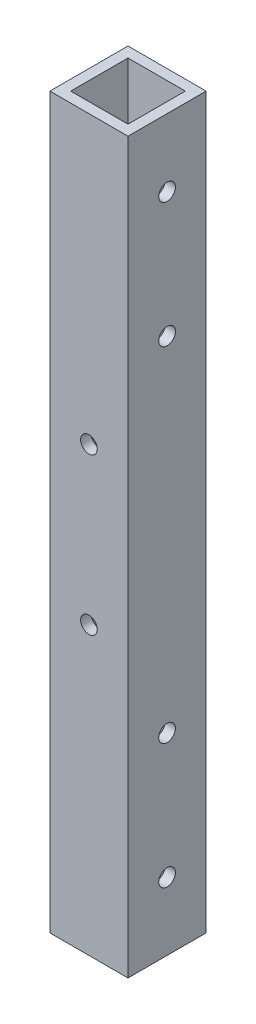
ISO-10303-21;
HEADER;
FILE_DESCRIPTION(('STEP AP214'),'2;1');
FILE_NAME('part.step','',(''),(''),'','','');
FILE_SCHEMA(('AUTOMOTIVE_DESIGN { 1 0 10303 214 1 1 1 1 }'));
ENDSEC;
DATA;
#1=APPLICATION_CONTEXT('core data for automotive mechanical design processes');
#2=APPLICATION_PROTOCOL_DEFINITION('international standard','automotive_design',2000,#1);
#3=PRODUCT_CONTEXT('',#1,'mechanical');
#4=PRODUCT('Part','Part','',(#3));
#5=PRODUCT_RELATED_PRODUCT_CATEGORY('part','',(#4));
#6=PRODUCT_DEFINITION_FORMATION('','',#4);
#7=PRODUCT_DEFINITION_CONTEXT('part definition',#1,'design');
#8=PRODUCT_DEFINITION('design','',#6,#7);
#9=PRODUCT_DEFINITION_SHAPE('','',#8);
#10=(LENGTH_UNIT() NAMED_UNIT(*) SI_UNIT(.MILLI.,.METRE.));
#11=(NAMED_UNIT(*) PLANE_ANGLE_UNIT() SI_UNIT($,.RADIAN.));
#12=(NAMED_UNIT(*) SI_UNIT($,.STERADIAN.) SOLID_ANGLE_UNIT());
#13=UNCERTAINTY_MEASURE_WITH_UNIT(LENGTH_MEASURE(1.E-05),#10,'distance_accuracy_value','');
#14=(GEOMETRIC_REPRESENTATION_CONTEXT(3) GLOBAL_UNCERTAINTY_ASSIGNED_CONTEXT((#13)) GLOBAL_UNIT_ASSIGNED_CONTEXT((#10,
#11,#12)) REPRESENTATION_CONTEXT('',''));
#15=CARTESIAN_POINT('',(0.,0.,0.));
#16=DIRECTION('',(0.,0.,1.));
#17=DIRECTION('',(1.,0.,0.));
#18=AXIS2_PLACEMENT_3D('',#15,#16,#17);
#19=CARTESIAN_POINT('',(0.,140.,0.));
#20=DIRECTION('',(0.,-1.,0.));
#21=DIRECTION('',(0.,0.,-1.));
#22=AXIS2_PLACEMENT_3D('',#19,#20,#21);
#23=PLANE('',#22);
#24=DIRECTION('',(0.,0.,1.));
#25=VECTOR('',#24,1.);
#26=CARTESIAN_POINT('',(0.,140.,0.));
#27=LINE('',#26,#25);
#28=CARTESIAN_POINT('',(0.,140.,-15.));
#29=VERTEX_POINT('',#28);
#30=CARTESIAN_POINT('',(0.,140.,0.));
#31=VERTEX_POINT('',#30);
#32=EDGE_CURVE('E162',#29,#31,#27,.T.);
#33=ORIENTED_EDGE('',*,*,#32,.T.);
#34=DIRECTION('',(1.,0.,0.));
#35=VECTOR('',#34,1.);
#36=CARTESIAN_POINT('',(0.,140.,0.));
#37=LINE('',#36,#35);
#38=CARTESIAN_POINT('',(15.,140.,0.));
#39=VERTEX_POINT('',#38);
#40=EDGE_CURVE('E166',#31,#39,#37,.T.);
#41=ORIENTED_EDGE('',*,*,#40,.T.);
#42=DIRECTION('',(0.,0.,-1.));
#43=VECTOR('',#42,1.);
#44=CARTESIAN_POINT('',(15.,140.,0.));
#45=LINE('',#44,#43);
#46=CARTESIAN_POINT('',(15.,140.,-15.));
#47=VERTEX_POINT('',#46);
#48=EDGE_CURVE('E170',#39,#47,#45,.T.);
#49=ORIENTED_EDGE('',*,*,#48,.T.);
#50=DIRECTION('',(-1.,0.,0.));
#51=VECTOR('',#50,1.);
#52=CARTESIAN_POINT('',(0.,140.,-15.));
#53=LINE('',#52,#51);
#54=EDGE_CURVE('E173',#47,#29,#53,.T.);
#55=ORIENTED_EDGE('',*,*,#54,.T.);
#56=EDGE_LOOP('',(#33,#41,#49,#55));
#57=FACE_BOUND('',#56,.T.);
#58=DIRECTION('',(1.,0.,0.));
#59=VECTOR('',#58,1.);
#60=CARTESIAN_POINT('',(2.,140.,-2.));
#61=LINE('',#60,#59);
#62=CARTESIAN_POINT('',(2.,140.,-2.));
#63=VERTEX_POINT('',#62);
#64=CARTESIAN_POINT('',(13.,140.,-2.));
#65=VERTEX_POINT('',#64);
#66=EDGE_CURVE('E112',#63,#65,#61,.T.);
#67=ORIENTED_EDGE('',*,*,#66,.F.);
#68=DIRECTION('',(0.,0.,1.));
#69=VECTOR('',#68,1.);
#70=CARTESIAN_POINT('',(2.,140.,-2.));
#71=LINE('',#70,#69);
#72=CARTESIAN_POINT('',(2.,140.,-13.));
#73=VERTEX_POINT('',#72);
#74=EDGE_CURVE('E138',#73,#63,#71,.T.);
#75=ORIENTED_EDGE('',*,*,#74,.F.);
#76=DIRECTION('',(-1.,0.,0.));
#77=VECTOR('',#76,1.);
#78=CARTESIAN_POINT('',(2.,140.,-13.));
#79=LINE('',#78,#77);
#80=CARTESIAN_POINT('',(13.,140.,-13.));
#81=VERTEX_POINT('',#80);
#82=EDGE_CURVE('E134',#81,#73,#79,.T.);
#83=ORIENTED_EDGE('',*,*,#82,.F.);
#84=DIRECTION('',(0.,0.,-1.));
#85=VECTOR('',#84,1.);
#86=CARTESIAN_POINT('',(13.,140.,-2.));
#87=LINE('',#86,#85);
#88=EDGE_CURVE('E121',#65,#81,#87,.T.);
#89=ORIENTED_EDGE('',*,*,#88,.F.);
#90=EDGE_LOOP('',(#67,#75,#83,#89));
#91=FACE_BOUND('',#90,.T.);
#92=ADVANCED_FACE('F44',(#57,#91),#23,.F.);
#93=CARTESIAN_POINT('',(0.,0.,0.));
#94=DIRECTION('',(0.,-1.,0.));
#95=DIRECTION('',(0.,0.,-1.));
#96=AXIS2_PLACEMENT_3D('',#93,#94,#95);
#97=PLANE('',#96);
#98=DIRECTION('',(0.,0.,1.));
#99=VECTOR('',#98,1.);
#100=CARTESIAN_POINT('',(0.,0.,0.));
#101=LINE('',#100,#99);
#102=CARTESIAN_POINT('',(0.,0.,-15.));
#103=VERTEX_POINT('',#102);
#104=CARTESIAN_POINT('',(0.,0.,0.));
#105=VERTEX_POINT('',#104);
#106=EDGE_CURVE('E130',#103,#105,#101,.T.);
#107=ORIENTED_EDGE('',*,*,#106,.F.);
#108=DIRECTION('',(-1.,0.,0.));
#109=VECTOR('',#108,1.);
#110=CARTESIAN_POINT('',(0.,0.,-15.));
#111=LINE('',#110,#109);
#112=CARTESIAN_POINT('',(15.,0.,-15.));
#113=VERTEX_POINT('',#112);
#114=EDGE_CURVE('E167',#113,#103,#111,.T.);
#115=ORIENTED_EDGE('',*,*,#114,.F.);
#116=DIRECTION('',(0.,0.,-1.));
#117=VECTOR('',#116,1.);
#118=CARTESIAN_POINT('',(15.,0.,0.));
#119=LINE('',#118,#117);
#120=CARTESIAN_POINT('',(15.,0.,0.));
#121=VERTEX_POINT('',#120);
#122=EDGE_CURVE('E183',#121,#113,#119,.T.);
#123=ORIENTED_EDGE('',*,*,#122,.F.);
#124=DIRECTION('',(1.,0.,0.));
#125=VECTOR('',#124,1.);
#126=CARTESIAN_POINT('',(0.,0.,0.));
#127=LINE('',#126,#125);
#128=EDGE_CURVE('E180',#105,#121,#127,.T.);
#129=ORIENTED_EDGE('',*,*,#128,.F.);
#130=EDGE_LOOP('',(#107,#115,#123,#129));
#131=FACE_BOUND('',#130,.T.);
#132=DIRECTION('',(0.,0.,1.));
#133=VECTOR('',#132,1.);
#134=CARTESIAN_POINT('',(2.,0.,-2.));
#135=LINE('',#134,#133);
#136=CARTESIAN_POINT('',(2.,0.,-13.));
#137=VERTEX_POINT('',#136);
#138=CARTESIAN_POINT('',(2.,0.,-2.));
#139=VERTEX_POINT('',#138);
#140=EDGE_CURVE('E122',#137,#139,#135,.T.);
#141=ORIENTED_EDGE('',*,*,#140,.T.);
#142=DIRECTION('',(1.,0.,0.));
#143=VECTOR('',#142,1.);
#144=CARTESIAN_POINT('',(2.,0.,-2.));
#145=LINE('',#144,#143);
#146=CARTESIAN_POINT('',(13.,0.,-2.));
#147=VERTEX_POINT('',#146);
#148=EDGE_CURVE('E70',#139,#147,#145,.T.);
#149=ORIENTED_EDGE('',*,*,#148,.T.);
#150=DIRECTION('',(0.,0.,-1.));
#151=VECTOR('',#150,1.);
#152=CARTESIAN_POINT('',(13.,0.,-2.));
#153=LINE('',#152,#151);
#154=CARTESIAN_POINT('',(13.,0.,-13.));
#155=VERTEX_POINT('',#154);
#156=EDGE_CURVE('E128',#147,#155,#153,.T.);
#157=ORIENTED_EDGE('',*,*,#156,.T.);
#158=DIRECTION('',(-1.,0.,0.));
#159=VECTOR('',#158,1.);
#160=CARTESIAN_POINT('',(2.,0.,-13.));
#161=LINE('',#160,#159);
#162=EDGE_CURVE('E149',#155,#137,#161,.T.);
#163=ORIENTED_EDGE('',*,*,#162,.T.);
#164=EDGE_LOOP('',(#141,#149,#157,#163));
#165=FACE_BOUND('',#164,.T.);
#166=ADVANCED_FACE('F331',(#131,#165),#97,.T.);
#167=CARTESIAN_POINT('',(0.,140.,0.));
#168=DIRECTION('',(1.,0.,0.));
#169=DIRECTION('',(0.,0.,-1.));
#170=AXIS2_PLACEMENT_3D('',#167,#168,#169);
#171=PLANE('',#170);
#172=CARTESIAN_POINT('',(0.,12.9999999999999,-7.50000000000069));
#173=DIRECTION('',(1.,0.,0.));
#174=DIRECTION('',(0.,0.,-1.));
#175=AXIS2_PLACEMENT_3D('',#172,#173,#174);
#176=CIRCLE('',#175,1.6);
#177=CARTESIAN_POINT('',(0.,12.9999999999999,-9.10000000000069));
#178=VERTEX_POINT('',#177);
#179=EDGE_CURVE('E203',#178,#178,#176,.T.);
#180=ORIENTED_EDGE('',*,*,#179,.T.);
#181=EDGE_LOOP('',(#180));
#182=FACE_BOUND('',#181,.T.);
#183=CARTESIAN_POINT('',(0.,37.,-7.50000000000069));
#184=DIRECTION('',(1.,0.,0.));
#185=DIRECTION('',(0.,0.,-1.));
#186=AXIS2_PLACEMENT_3D('',#183,#184,#185);
#187=CIRCLE('',#186,1.6);
#188=CARTESIAN_POINT('',(0.,37.,-9.10000000000069));
#189=VERTEX_POINT('',#188);
#190=EDGE_CURVE('E261',#189,#189,#187,.T.);
#191=ORIENTED_EDGE('',*,*,#190,.T.);
#192=EDGE_LOOP('',(#191));
#193=FACE_BOUND('',#192,.T.);
#194=CARTESIAN_POINT('',(0.,103.,-7.50000000000069));
#195=DIRECTION('',(1.,0.,0.));
#196=DIRECTION('',(0.,0.,1.));
#197=AXIS2_PLACEMENT_3D('',#194,#195,#196);
#198=CIRCLE('',#197,1.6);
#199=CARTESIAN_POINT('',(0.,103.,-5.90000000000069));
#200=VERTEX_POINT('',#199);
#201=EDGE_CURVE('E269',#200,#200,#198,.T.);
#202=ORIENTED_EDGE('',*,*,#201,.T.);
#203=EDGE_LOOP('',(#202));
#204=FACE_BOUND('',#203,.T.);
#205=CARTESIAN_POINT('',(0.,127.,-7.50000000000069));
#206=DIRECTION('',(1.,0.,0.));
#207=DIRECTION('',(0.,0.,1.));
#208=AXIS2_PLACEMENT_3D('',#205,#206,#207);
#209=CIRCLE('',#208,1.60000000000001);
#210=CARTESIAN_POINT('',(0.,127.,-5.90000000000068));
#211=VERTEX_POINT('',#210);
#212=EDGE_CURVE('E249',#211,#211,#209,.T.);
#213=ORIENTED_EDGE('',*,*,#212,.T.);
#214=EDGE_LOOP('',(#213));
#215=FACE_BOUND('',#214,.T.);
#216=ORIENTED_EDGE('',*,*,#106,.T.);
#217=DIRECTION('',(0.,-1.,0.));
#218=VECTOR('',#217,1.);
#219=CARTESIAN_POINT('',(0.,140.,0.));
#220=LINE('',#219,#218);
#221=EDGE_CURVE('E11',#31,#105,#220,.T.);
#222=ORIENTED_EDGE('',*,*,#221,.F.);
#223=ORIENTED_EDGE('',*,*,#32,.F.);
#224=DIRECTION('',(0.,-1.,0.));
#225=VECTOR('',#224,1.);
#226=CARTESIAN_POINT('',(0.,140.,-15.));
#227=LINE('',#226,#225);
#228=EDGE_CURVE('E176',#29,#103,#227,.T.);
#229=ORIENTED_EDGE('',*,*,#228,.T.);
#230=EDGE_LOOP('',(#216,#222,#223,#229));
#231=FACE_BOUND('',#230,.T.);
#232=ADVANCED_FACE('F46',(#182,#193,#204,#215,#231),#171,.F.);
#233=CARTESIAN_POINT('',(0.,140.,0.));
#234=DIRECTION('',(0.,0.,-1.));
#235=DIRECTION('',(-1.,0.,0.));
#236=AXIS2_PLACEMENT_3D('',#233,#234,#235);
#237=PLANE('',#236);
#238=CARTESIAN_POINT('',(7.50000000000001,85.,0.));
#239=DIRECTION('',(0.,0.,1.));
#240=DIRECTION('',(1.,0.,0.));
#241=AXIS2_PLACEMENT_3D('',#238,#239,#240);
#242=CIRCLE('',#241,1.6);
#243=CARTESIAN_POINT('',(9.10000000000001,85.,0.));
#244=VERTEX_POINT('',#243);
#245=EDGE_CURVE('E229',#244,#244,#242,.T.);
#246=ORIENTED_EDGE('',*,*,#245,.F.);
#247=EDGE_LOOP('',(#246));
#248=FACE_BOUND('',#247,.T.);
#249=CARTESIAN_POINT('',(7.50000000000001,55.,0.));
#250=DIRECTION('',(0.,0.,1.));
#251=DIRECTION('',(1.,0.,0.));
#252=AXIS2_PLACEMENT_3D('',#249,#250,#251);
#253=CIRCLE('',#252,1.6);
#254=CARTESIAN_POINT('',(9.10000000000001,55.,0.));
#255=VERTEX_POINT('',#254);
#256=EDGE_CURVE('E235',#255,#255,#253,.T.);
#257=ORIENTED_EDGE('',*,*,#256,.F.);
#258=EDGE_LOOP('',(#257));
#259=FACE_BOUND('',#258,.T.);
#260=ORIENTED_EDGE('',*,*,#128,.T.);
#261=DIRECTION('',(0.,-1.,0.));
#262=VECTOR('',#261,1.);
#263=CARTESIAN_POINT('',(15.,140.,0.));
#264=LINE('',#263,#262);
#265=EDGE_CURVE('E54',#39,#121,#264,.T.);
#266=ORIENTED_EDGE('',*,*,#265,.F.);
#267=ORIENTED_EDGE('',*,*,#40,.F.);
#268=ORIENTED_EDGE('',*,*,#221,.T.);
#269=EDGE_LOOP('',(#260,#266,#267,#268));
#270=FACE_BOUND('',#269,.T.);
#271=ADVANCED_FACE('F318',(#248,#259,#270),#237,.F.);
#272=CARTESIAN_POINT('',(15.,140.,0.));
#273=DIRECTION('',(-1.,0.,0.));
#274=DIRECTION('',(0.,0.,1.));
#275=AXIS2_PLACEMENT_3D('',#272,#273,#274);
#276=PLANE('',#275);
#277=CARTESIAN_POINT('',(15.,12.9999999999999,-7.50000000000069));
#278=DIRECTION('',(1.,0.,0.));
#279=DIRECTION('',(0.,0.,-1.));
#280=AXIS2_PLACEMENT_3D('',#277,#278,#279);
#281=CIRCLE('',#280,1.6);
#282=CARTESIAN_POINT('',(15.,12.9999999999999,-9.10000000000069));
#283=VERTEX_POINT('',#282);
#284=EDGE_CURVE('E253',#283,#283,#281,.T.);
#285=ORIENTED_EDGE('',*,*,#284,.F.);
#286=EDGE_LOOP('',(#285));
#287=FACE_BOUND('',#286,.T.);
#288=CARTESIAN_POINT('',(15.,37.,-7.50000000000069));
#289=DIRECTION('',(1.,0.,0.));
#290=DIRECTION('',(0.,0.,-1.));
#291=AXIS2_PLACEMENT_3D('',#288,#289,#290);
#292=CIRCLE('',#291,1.6);
#293=CARTESIAN_POINT('',(15.,37.,-9.10000000000069));
#294=VERTEX_POINT('',#293);
#295=EDGE_CURVE('E257',#294,#294,#292,.T.);
#296=ORIENTED_EDGE('',*,*,#295,.F.);
#297=EDGE_LOOP('',(#296));
#298=FACE_BOUND('',#297,.T.);
#299=CARTESIAN_POINT('',(15.,103.,-7.50000000000069));
#300=DIRECTION('',(1.,0.,0.));
#301=DIRECTION('',(0.,0.,1.));
#302=AXIS2_PLACEMENT_3D('',#299,#300,#301);
#303=CIRCLE('',#302,1.6);
#304=CARTESIAN_POINT('',(15.,103.,-5.90000000000069));
#305=VERTEX_POINT('',#304);
#306=EDGE_CURVE('E265',#305,#305,#303,.T.);
#307=ORIENTED_EDGE('',*,*,#306,.F.);
#308=EDGE_LOOP('',(#307));
#309=FACE_BOUND('',#308,.T.);
#310=CARTESIAN_POINT('',(15.,127.,-7.50000000000069));
#311=DIRECTION('',(1.,0.,0.));
#312=DIRECTION('',(0.,0.,1.));
#313=AXIS2_PLACEMENT_3D('',#310,#311,#312);
#314=CIRCLE('',#313,1.60000000000001);
#315=CARTESIAN_POINT('',(15.,127.,-5.90000000000068));
#316=VERTEX_POINT('',#315);
#317=EDGE_CURVE('E273',#316,#316,#314,.T.);
#318=ORIENTED_EDGE('',*,*,#317,.F.);
#319=EDGE_LOOP('',(#318));
#320=FACE_BOUND('',#319,.T.);
#321=ORIENTED_EDGE('',*,*,#122,.T.);
#322=DIRECTION('',(0.,-1.,0.));
#323=VECTOR('',#322,1.);
#324=CARTESIAN_POINT('',(15.,140.,-15.));
#325=LINE('',#324,#323);
#326=EDGE_CURVE('E191',#47,#113,#325,.T.);
#327=ORIENTED_EDGE('',*,*,#326,.F.);
#328=ORIENTED_EDGE('',*,*,#48,.F.);
#329=ORIENTED_EDGE('',*,*,#265,.T.);
#330=EDGE_LOOP('',(#321,#327,#328,#329));
#331=FACE_BOUND('',#330,.T.);
#332=ADVANCED_FACE('F314',(#287,#298,#309,#320,#331),#276,.F.);
#333=CARTESIAN_POINT('',(0.,140.,-15.));
#334=DIRECTION('',(0.,0.,1.));
#335=DIRECTION('',(1.,0.,0.));
#336=AXIS2_PLACEMENT_3D('',#333,#334,#335);
#337=PLANE('',#336);
#338=CARTESIAN_POINT('',(7.50000000000001,85.,-15.));
#339=DIRECTION('',(0.,0.,1.));
#340=DIRECTION('',(1.,0.,0.));
#341=AXIS2_PLACEMENT_3D('',#338,#339,#340);
#342=CIRCLE('',#341,1.6);
#343=CARTESIAN_POINT('',(9.10000000000001,85.,-15.));
#344=VERTEX_POINT('',#343);
#345=EDGE_CURVE('E221',#344,#344,#342,.T.);
#346=ORIENTED_EDGE('',*,*,#345,.T.);
#347=EDGE_LOOP('',(#346));
#348=FACE_BOUND('',#347,.T.);
#349=CARTESIAN_POINT('',(7.50000000000001,55.,-15.));
#350=DIRECTION('',(0.,0.,1.));
#351=DIRECTION('',(1.,0.,0.));
#352=AXIS2_PLACEMENT_3D('',#349,#350,#351);
#353=CIRCLE('',#352,1.6);
#354=CARTESIAN_POINT('',(9.10000000000001,55.,-15.));
#355=VERTEX_POINT('',#354);
#356=EDGE_CURVE('E241',#355,#355,#353,.T.);
#357=ORIENTED_EDGE('',*,*,#356,.T.);
#358=EDGE_LOOP('',(#357));
#359=FACE_BOUND('',#358,.T.);
#360=ORIENTED_EDGE('',*,*,#114,.T.);
#361=ORIENTED_EDGE('',*,*,#228,.F.);
#362=ORIENTED_EDGE('',*,*,#54,.F.);
#363=ORIENTED_EDGE('',*,*,#326,.T.);
#364=EDGE_LOOP('',(#360,#361,#362,#363));
#365=FACE_BOUND('',#364,.T.);
#366=ADVANCED_FACE('F317',(#348,#359,#365),#337,.F.);
#367=CARTESIAN_POINT('',(2.,140.,-2.));
#368=DIRECTION('',(0.,0.,-1.));
#369=DIRECTION('',(-1.,0.,0.));
#370=AXIS2_PLACEMENT_3D('',#367,#368,#369);
#371=PLANE('',#370);
#372=CARTESIAN_POINT('',(7.50000000000001,85.,-2.));
#373=DIRECTION('',(0.,0.,-1.));
#374=DIRECTION('',(-1.,0.,0.));
#375=AXIS2_PLACEMENT_3D('',#372,#373,#374);
#376=CIRCLE('',#375,1.6);
#377=CARTESIAN_POINT('',(5.9,85.,-2.));
#378=VERTEX_POINT('',#377);
#379=EDGE_CURVE('E245',#378,#378,#376,.T.);
#380=ORIENTED_EDGE('',*,*,#379,.F.);
#381=EDGE_LOOP('',(#380));
#382=FACE_BOUND('',#381,.T.);
#383=CARTESIAN_POINT('',(7.50000000000001,55.,-2.));
#384=DIRECTION('',(0.,0.,-1.));
#385=DIRECTION('',(-1.,0.,0.));
#386=AXIS2_PLACEMENT_3D('',#383,#384,#385);
#387=CIRCLE('',#386,1.6);
#388=CARTESIAN_POINT('',(5.90000000000001,55.,-2.));
#389=VERTEX_POINT('',#388);
#390=EDGE_CURVE('E220',#389,#389,#387,.T.);
#391=ORIENTED_EDGE('',*,*,#390,.F.);
#392=EDGE_LOOP('',(#391));
#393=FACE_BOUND('',#392,.T.);
#394=ORIENTED_EDGE('',*,*,#148,.F.);
#395=DIRECTION('',(0.,-1.,0.));
#396=VECTOR('',#395,1.);
#397=CARTESIAN_POINT('',(2.,140.,-2.));
#398=LINE('',#397,#396);
#399=EDGE_CURVE('E116',#63,#139,#398,.T.);
#400=ORIENTED_EDGE('',*,*,#399,.F.);
#401=ORIENTED_EDGE('',*,*,#66,.T.);
#402=DIRECTION('',(0.,-1.,0.));
#403=VECTOR('',#402,1.);
#404=CARTESIAN_POINT('',(13.,140.,-2.));
#405=LINE('',#404,#403);
#406=EDGE_CURVE('E115',#65,#147,#405,.T.);
#407=ORIENTED_EDGE('',*,*,#406,.T.);
#408=EDGE_LOOP('',(#394,#400,#401,#407));
#409=FACE_BOUND('',#408,.T.);
#410=ADVANCED_FACE('F114',(#382,#393,#409),#371,.T.);
#411=CARTESIAN_POINT('',(13.,140.,-2.));
#412=DIRECTION('',(-1.,0.,0.));
#413=DIRECTION('',(0.,0.,1.));
#414=AXIS2_PLACEMENT_3D('',#411,#412,#413);
#415=PLANE('',#414);
#416=CARTESIAN_POINT('',(13.,12.9999999999999,-7.50000000000069));
#417=DIRECTION('',(-1.,0.,0.));
#418=DIRECTION('',(0.,0.,1.));
#419=AXIS2_PLACEMENT_3D('',#416,#417,#418);
#420=CIRCLE('',#419,1.6);
#421=CARTESIAN_POINT('',(13.,12.9999999999999,-5.90000000000069));
#422=VERTEX_POINT('',#421);
#423=EDGE_CURVE('E146',#422,#422,#420,.T.);
#424=ORIENTED_EDGE('',*,*,#423,.F.);
#425=EDGE_LOOP('',(#424));
#426=FACE_BOUND('',#425,.T.);
#427=CARTESIAN_POINT('',(13.,37.,-7.50000000000069));
#428=DIRECTION('',(-1.,0.,0.));
#429=DIRECTION('',(0.,0.,1.));
#430=AXIS2_PLACEMENT_3D('',#427,#428,#429);
#431=CIRCLE('',#430,1.6);
#432=CARTESIAN_POINT('',(13.,37.,-5.90000000000069));
#433=VERTEX_POINT('',#432);
#434=EDGE_CURVE('E213',#433,#433,#431,.T.);
#435=ORIENTED_EDGE('',*,*,#434,.F.);
#436=EDGE_LOOP('',(#435));
#437=FACE_BOUND('',#436,.T.);
#438=CARTESIAN_POINT('',(13.,103.,-7.50000000000069));
#439=DIRECTION('',(-1.,0.,0.));
#440=DIRECTION('',(0.,0.,1.));
#441=AXIS2_PLACEMENT_3D('',#438,#439,#440);
#442=CIRCLE('',#441,1.6);
#443=CARTESIAN_POINT('',(13.,103.,-5.90000000000069));
#444=VERTEX_POINT('',#443);
#445=EDGE_CURVE('E208',#444,#444,#442,.T.);
#446=ORIENTED_EDGE('',*,*,#445,.F.);
#447=EDGE_LOOP('',(#446));
#448=FACE_BOUND('',#447,.T.);
#449=CARTESIAN_POINT('',(13.,127.,-7.50000000000069));
#450=DIRECTION('',(-1.,0.,0.));
#451=DIRECTION('',(0.,0.,1.));
#452=AXIS2_PLACEMENT_3D('',#449,#450,#451);
#453=CIRCLE('',#452,1.60000000000001);
#454=CARTESIAN_POINT('',(13.,127.,-5.90000000000068));
#455=VERTEX_POINT('',#454);
#456=EDGE_CURVE('E202',#455,#455,#453,.T.);
#457=ORIENTED_EDGE('',*,*,#456,.F.);
#458=EDGE_LOOP('',(#457));
#459=FACE_BOUND('',#458,.T.);
#460=ORIENTED_EDGE('',*,*,#156,.F.);
#461=ORIENTED_EDGE('',*,*,#406,.F.);
#462=ORIENTED_EDGE('',*,*,#88,.T.);
#463=DIRECTION('',(0.,-1.,0.));
#464=VECTOR('',#463,1.);
#465=CARTESIAN_POINT('',(13.,140.,-13.));
#466=LINE('',#465,#464);
#467=EDGE_CURVE('E131',#81,#155,#466,.T.);
#468=ORIENTED_EDGE('',*,*,#467,.T.);
#469=EDGE_LOOP('',(#460,#461,#462,#468));
#470=FACE_BOUND('',#469,.T.);
#471=ADVANCED_FACE('F125',(#426,#437,#448,#459,#470),#415,.T.);
#472=CARTESIAN_POINT('',(2.,140.,-13.));
#473=DIRECTION('',(0.,0.,1.));
#474=DIRECTION('',(1.,0.,0.));
#475=AXIS2_PLACEMENT_3D('',#472,#473,#474);
#476=PLANE('',#475);
#477=CARTESIAN_POINT('',(7.50000000000001,85.,-13.));
#478=DIRECTION('',(0.,0.,1.));
#479=DIRECTION('',(1.,0.,0.));
#480=AXIS2_PLACEMENT_3D('',#477,#478,#479);
#481=CIRCLE('',#480,1.6);
#482=CARTESIAN_POINT('',(9.10000000000001,85.,-13.));
#483=VERTEX_POINT('',#482);
#484=EDGE_CURVE('E48',#483,#483,#481,.T.);
#485=ORIENTED_EDGE('',*,*,#484,.F.);
#486=EDGE_LOOP('',(#485));
#487=FACE_BOUND('',#486,.T.);
#488=CARTESIAN_POINT('',(7.50000000000001,55.,-13.));
#489=DIRECTION('',(0.,0.,1.));
#490=DIRECTION('',(1.,0.,0.));
#491=AXIS2_PLACEMENT_3D('',#488,#489,#490);
#492=CIRCLE('',#491,1.6);
#493=CARTESIAN_POINT('',(9.10000000000001,55.,-13.));
#494=VERTEX_POINT('',#493);
#495=EDGE_CURVE('E217',#494,#494,#492,.T.);
#496=ORIENTED_EDGE('',*,*,#495,.F.);
#497=EDGE_LOOP('',(#496));
#498=FACE_BOUND('',#497,.T.);
#499=ORIENTED_EDGE('',*,*,#162,.F.);
#500=ORIENTED_EDGE('',*,*,#467,.F.);
#501=ORIENTED_EDGE('',*,*,#82,.T.);
#502=DIRECTION('',(0.,-1.,0.));
#503=VECTOR('',#502,1.);
#504=CARTESIAN_POINT('',(2.,140.,-13.));
#505=LINE('',#504,#503);
#506=EDGE_CURVE('E62',#73,#137,#505,.T.);
#507=ORIENTED_EDGE('',*,*,#506,.T.);
#508=EDGE_LOOP('',(#499,#500,#501,#507));
#509=FACE_BOUND('',#508,.T.);
#510=ADVANCED_FACE('F297',(#487,#498,#509),#476,.T.);
#511=CARTESIAN_POINT('',(2.,140.,-2.));
#512=DIRECTION('',(1.,0.,0.));
#513=DIRECTION('',(0.,0.,-1.));
#514=AXIS2_PLACEMENT_3D('',#511,#512,#513);
#515=PLANE('',#514);
#516=CARTESIAN_POINT('',(2.,12.9999999999999,-7.50000000000069));
#517=DIRECTION('',(1.,0.,0.));
#518=DIRECTION('',(0.,0.,-1.));
#519=AXIS2_PLACEMENT_3D('',#516,#517,#518);
#520=CIRCLE('',#519,1.6);
#521=CARTESIAN_POINT('',(2.,12.9999999999999,-9.10000000000069));
#522=VERTEX_POINT('',#521);
#523=EDGE_CURVE('E214',#522,#522,#520,.T.);
#524=ORIENTED_EDGE('',*,*,#523,.F.);
#525=EDGE_LOOP('',(#524));
#526=FACE_BOUND('',#525,.T.);
#527=CARTESIAN_POINT('',(2.,37.,-7.50000000000069));
#528=DIRECTION('',(1.,0.,0.));
#529=DIRECTION('',(0.,0.,-1.));
#530=AXIS2_PLACEMENT_3D('',#527,#528,#529);
#531=CIRCLE('',#530,1.6);
#532=CARTESIAN_POINT('',(2.,37.,-9.10000000000069));
#533=VERTEX_POINT('',#532);
#534=EDGE_CURVE('E209',#533,#533,#531,.T.);
#535=ORIENTED_EDGE('',*,*,#534,.F.);
#536=EDGE_LOOP('',(#535));
#537=FACE_BOUND('',#536,.T.);
#538=CARTESIAN_POINT('',(2.,103.,-7.50000000000069));
#539=DIRECTION('',(1.,0.,0.));
#540=DIRECTION('',(0.,0.,-1.));
#541=AXIS2_PLACEMENT_3D('',#538,#539,#540);
#542=CIRCLE('',#541,1.6);
#543=CARTESIAN_POINT('',(2.,103.,-9.10000000000069));
#544=VERTEX_POINT('',#543);
#545=EDGE_CURVE('E204',#544,#544,#542,.T.);
#546=ORIENTED_EDGE('',*,*,#545,.F.);
#547=EDGE_LOOP('',(#546));
#548=FACE_BOUND('',#547,.T.);
#549=CARTESIAN_POINT('',(2.,127.,-7.50000000000069));
#550=DIRECTION('',(1.,0.,0.));
#551=DIRECTION('',(0.,0.,-1.));
#552=AXIS2_PLACEMENT_3D('',#549,#550,#551);
#553=CIRCLE('',#552,1.60000000000001);
#554=CARTESIAN_POINT('',(2.,127.,-9.10000000000069));
#555=VERTEX_POINT('',#554);
#556=EDGE_CURVE('E198',#555,#555,#553,.T.);
#557=ORIENTED_EDGE('',*,*,#556,.F.);
#558=EDGE_LOOP('',(#557));
#559=FACE_BOUND('',#558,.T.);
#560=ORIENTED_EDGE('',*,*,#140,.F.);
#561=ORIENTED_EDGE('',*,*,#506,.F.);
#562=ORIENTED_EDGE('',*,*,#74,.T.);
#563=ORIENTED_EDGE('',*,*,#399,.T.);
#564=EDGE_LOOP('',(#560,#561,#562,#563));
#565=FACE_BOUND('',#564,.T.);
#566=ADVANCED_FACE('F417',(#526,#537,#548,#559,#565),#515,.T.);
#567=CARTESIAN_POINT('',(0.,127.,-7.50000000000069));
#568=DIRECTION('',(1.,0.,0.));
#569=DIRECTION('',(0.,0.,-1.));
#570=AXIS2_PLACEMENT_3D('',#567,#568,#569);
#571=CYLINDRICAL_SURFACE('',#570,1.60000000000001);
#572=ORIENTED_EDGE('',*,*,#556,.T.);
#573=EDGE_LOOP('',(#572));
#574=FACE_BOUND('',#573,.T.);
#575=ORIENTED_EDGE('',*,*,#212,.F.);
#576=EDGE_LOOP('',(#575));
#577=FACE_BOUND('',#576,.T.);
#578=ADVANCED_FACE('F311',(#574,#577),#571,.F.);
#579=CARTESIAN_POINT('',(0.,103.,-7.50000000000069));
#580=DIRECTION('',(1.,0.,0.));
#581=DIRECTION('',(0.,0.,-1.));
#582=AXIS2_PLACEMENT_3D('',#579,#580,#581);
#583=CYLINDRICAL_SURFACE('',#582,1.6);
#584=ORIENTED_EDGE('',*,*,#545,.T.);
#585=EDGE_LOOP('',(#584));
#586=FACE_BOUND('',#585,.T.);
#587=ORIENTED_EDGE('',*,*,#201,.F.);
#588=EDGE_LOOP('',(#587));
#589=FACE_BOUND('',#588,.T.);
#590=ADVANCED_FACE('F452',(#586,#589),#583,.F.);
#591=CARTESIAN_POINT('',(0.,37.,-7.50000000000069));
#592=DIRECTION('',(1.,0.,0.));
#593=DIRECTION('',(0.,0.,-1.));
#594=AXIS2_PLACEMENT_3D('',#591,#592,#593);
#595=CYLINDRICAL_SURFACE('',#594,1.6);
#596=ORIENTED_EDGE('',*,*,#534,.T.);
#597=EDGE_LOOP('',(#596));
#598=FACE_BOUND('',#597,.T.);
#599=ORIENTED_EDGE('',*,*,#190,.F.);
#600=EDGE_LOOP('',(#599));
#601=FACE_BOUND('',#600,.T.);
#602=ADVANCED_FACE('F462',(#598,#601),#595,.F.);
#603=CARTESIAN_POINT('',(0.,12.9999999999999,-7.50000000000069));
#604=DIRECTION('',(1.,0.,0.));
#605=DIRECTION('',(0.,0.,-1.));
#606=AXIS2_PLACEMENT_3D('',#603,#604,#605);
#607=CYLINDRICAL_SURFACE('',#606,1.6);
#608=ORIENTED_EDGE('',*,*,#523,.T.);
#609=EDGE_LOOP('',(#608));
#610=FACE_BOUND('',#609,.T.);
#611=ORIENTED_EDGE('',*,*,#179,.F.);
#612=EDGE_LOOP('',(#611));
#613=FACE_BOUND('',#612,.T.);
#614=ADVANCED_FACE('F309',(#610,#613),#607,.F.);
#615=ORIENTED_EDGE('',*,*,#456,.T.);
#616=EDGE_LOOP('',(#615));
#617=FACE_BOUND('',#616,.T.);
#618=ORIENTED_EDGE('',*,*,#317,.T.);
#619=EDGE_LOOP('',(#618));
#620=FACE_BOUND('',#619,.T.);
#621=ADVANCED_FACE('F305',(#617,#620),#571,.F.);
#622=ORIENTED_EDGE('',*,*,#445,.T.);
#623=EDGE_LOOP('',(#622));
#624=FACE_BOUND('',#623,.T.);
#625=ORIENTED_EDGE('',*,*,#306,.T.);
#626=EDGE_LOOP('',(#625));
#627=FACE_BOUND('',#626,.T.);
#628=ADVANCED_FACE('F308',(#624,#627),#583,.F.);
#629=ORIENTED_EDGE('',*,*,#434,.T.);
#630=EDGE_LOOP('',(#629));
#631=FACE_BOUND('',#630,.T.);
#632=ORIENTED_EDGE('',*,*,#295,.T.);
#633=EDGE_LOOP('',(#632));
#634=FACE_BOUND('',#633,.T.);
#635=ADVANCED_FACE('F375',(#631,#634),#595,.F.);
#636=ORIENTED_EDGE('',*,*,#423,.T.);
#637=EDGE_LOOP('',(#636));
#638=FACE_BOUND('',#637,.T.);
#639=ORIENTED_EDGE('',*,*,#284,.T.);
#640=EDGE_LOOP('',(#639));
#641=FACE_BOUND('',#640,.T.);
#642=ADVANCED_FACE('F292',(#638,#641),#607,.F.);
#643=CARTESIAN_POINT('',(7.50000000000001,55.,-15.));
#644=DIRECTION('',(0.,0.,1.));
#645=DIRECTION('',(1.,0.,0.));
#646=AXIS2_PLACEMENT_3D('',#643,#644,#645);
#647=CYLINDRICAL_SURFACE('',#646,1.6);
#648=ORIENTED_EDGE('',*,*,#495,.T.);
#649=EDGE_LOOP('',(#648));
#650=FACE_BOUND('',#649,.T.);
#651=ORIENTED_EDGE('',*,*,#356,.F.);
#652=EDGE_LOOP('',(#651));
#653=FACE_BOUND('',#652,.T.);
#654=ADVANCED_FACE('F363',(#650,#653),#647,.F.);
#655=CARTESIAN_POINT('',(7.50000000000001,85.,-15.));
#656=DIRECTION('',(0.,0.,1.));
#657=DIRECTION('',(1.,0.,0.));
#658=AXIS2_PLACEMENT_3D('',#655,#656,#657);
#659=CYLINDRICAL_SURFACE('',#658,1.6);
#660=ORIENTED_EDGE('',*,*,#484,.T.);
#661=EDGE_LOOP('',(#660));
#662=FACE_BOUND('',#661,.T.);
#663=ORIENTED_EDGE('',*,*,#345,.F.);
#664=EDGE_LOOP('',(#663));
#665=FACE_BOUND('',#664,.T.);
#666=ADVANCED_FACE('F365',(#662,#665),#659,.F.);
#667=ORIENTED_EDGE('',*,*,#390,.T.);
#668=EDGE_LOOP('',(#667));
#669=FACE_BOUND('',#668,.T.);
#670=ORIENTED_EDGE('',*,*,#256,.T.);
#671=EDGE_LOOP('',(#670));
#672=FACE_BOUND('',#671,.T.);
#673=ADVANCED_FACE('F367',(#669,#672),#647,.F.);
#674=ORIENTED_EDGE('',*,*,#379,.T.);
#675=EDGE_LOOP('',(#674));
#676=FACE_BOUND('',#675,.T.);
#677=ORIENTED_EDGE('',*,*,#245,.T.);
#678=EDGE_LOOP('',(#677));
#679=FACE_BOUND('',#678,.T.);
#680=ADVANCED_FACE('F374',(#676,#679),#659,.F.);
#681=CLOSED_SHELL('',(#92,#166,#232,#271,#332,#366,#410,#471,#510,#566,#578,#590,#602,#614,#621,
#628,#635,#642,#654,#666,#673,#680));
#682=MANIFOLD_SOLID_BREP('B2',#681);
#683=ADVANCED_BREP_SHAPE_REPRESENTATION('',(#18,#682),#14);
#684=SHAPE_DEFINITION_REPRESENTATION(#9,#683);
ENDSEC;
END-ISO-10303-21;
